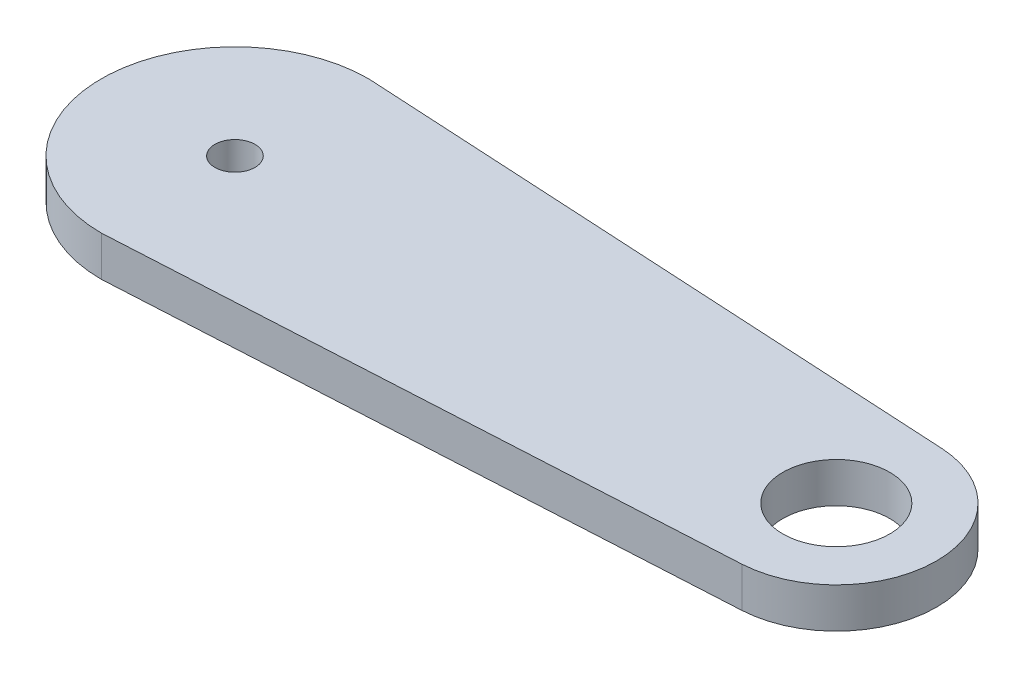
ISO-10303-21;
HEADER;
FILE_DESCRIPTION(('STEP AP214'),'2;1');
FILE_NAME('part.step','',(''),(''),'','','');
FILE_SCHEMA(('AUTOMOTIVE_DESIGN { 1 0 10303 214 1 1 1 1 }'));
ENDSEC;
DATA;
#1=APPLICATION_CONTEXT('core data for automotive mechanical design processes');
#2=APPLICATION_PROTOCOL_DEFINITION('international standard','automotive_design',2000,#1);
#3=PRODUCT_CONTEXT('',#1,'mechanical');
#4=PRODUCT('Part','Part','',(#3));
#5=PRODUCT_RELATED_PRODUCT_CATEGORY('part','',(#4));
#6=PRODUCT_DEFINITION_FORMATION('','',#4);
#7=PRODUCT_DEFINITION_CONTEXT('part definition',#1,'design');
#8=PRODUCT_DEFINITION('design','',#6,#7);
#9=PRODUCT_DEFINITION_SHAPE('','',#8);
#10=(LENGTH_UNIT() NAMED_UNIT(*) SI_UNIT(.MILLI.,.METRE.));
#11=(NAMED_UNIT(*) PLANE_ANGLE_UNIT() SI_UNIT($,.RADIAN.));
#12=(NAMED_UNIT(*) SI_UNIT($,.STERADIAN.) SOLID_ANGLE_UNIT());
#13=UNCERTAINTY_MEASURE_WITH_UNIT(LENGTH_MEASURE(1.E-05),#10,'distance_accuracy_value','');
#14=(GEOMETRIC_REPRESENTATION_CONTEXT(3) GLOBAL_UNCERTAINTY_ASSIGNED_CONTEXT((#13)) GLOBAL_UNIT_ASSIGNED_CONTEXT((#10,
#11,#12)) REPRESENTATION_CONTEXT('',''));
#15=CARTESIAN_POINT('',(0.,0.,0.));
#16=DIRECTION('',(0.,0.,1.));
#17=DIRECTION('',(1.,0.,0.));
#18=AXIS2_PLACEMENT_3D('',#15,#16,#17);
#19=CARTESIAN_POINT('',(0.551322959521135,3.,9.96951134361366));
#20=DIRECTION('',(-0.0552165341055908,0.,-0.998474403458279));
#21=DIRECTION('',(-0.998474403458279,0.,0.0552165341055908));
#22=AXIS2_PLACEMENT_3D('',#19,#20,#21);
#23=PLANE('',#22);
#24=DIRECTION('',(0.998474403458279,0.,-0.0552165341055908));
#25=VECTOR('',#24,1.);
#26=CARTESIAN_POINT('',(0.551322959521135,0.,9.96951134361366));
#27=LINE('',#26,#25);
#28=CARTESIAN_POINT('',(0.,0.,10.));
#29=VERTEX_POINT('',#28);
#30=CARTESIAN_POINT('',(45.4141240057906,0.,7.48855802574336));
#31=VERTEX_POINT('',#30);
#32=EDGE_CURVE('E95',#29,#31,#27,.T.);
#33=ORIENTED_EDGE('',*,*,#32,.T.);
#34=DIRECTION('',(0.,-1.,0.));
#35=VECTOR('',#34,1.);
#36=CARTESIAN_POINT('',(45.4141240057906,3.,7.48855802574336));
#37=LINE('',#36,#35);
#38=CARTESIAN_POINT('',(45.4141240057906,3.,7.48855802574336));
#39=VERTEX_POINT('',#38);
#40=EDGE_CURVE('E11',#39,#31,#37,.T.);
#41=ORIENTED_EDGE('',*,*,#40,.F.);
#42=DIRECTION('',(0.998474403458279,0.,-0.0552165341055908));
#43=VECTOR('',#42,1.);
#44=CARTESIAN_POINT('',(0.551322959521135,3.,9.96951134361366));
#45=LINE('',#44,#43);
#46=CARTESIAN_POINT('',(0.,3.,10.));
#47=VERTEX_POINT('',#46);
#48=EDGE_CURVE('E80',#47,#39,#45,.T.);
#49=ORIENTED_EDGE('',*,*,#48,.F.);
#50=DIRECTION('',(0.,-1.,0.));
#51=VECTOR('',#50,1.);
#52=CARTESIAN_POINT('',(0.,3.,10.));
#53=LINE('',#52,#51);
#54=EDGE_CURVE('E91',#47,#29,#53,.T.);
#55=ORIENTED_EDGE('',*,*,#54,.T.);
#56=EDGE_LOOP('',(#33,#41,#49,#55));
#57=FACE_BOUND('',#56,.T.);
#58=ADVANCED_FACE('F33',(#57),#23,.F.);
#59=CARTESIAN_POINT('',(45.,3.,-1.69055307946975E-10));
#60=DIRECTION('',(0.,-1.,0.));
#61=DIRECTION('',(0.,0.,-1.));
#62=AXIS2_PLACEMENT_3D('',#59,#60,#61);
#63=CYLINDRICAL_SURFACE('',#62,7.49999999995056);
#64=CARTESIAN_POINT('',(45.,0.,-1.69055307946975E-10));
#65=DIRECTION('',(0.,1.,0.));
#66=DIRECTION('',(0.,0.,1.));
#67=AXIS2_PLACEMENT_3D('',#64,#65,#66);
#68=CIRCLE('',#67,7.49999999995056);
#69=CARTESIAN_POINT('',(45.414124005735,0.,-7.48855802608454));
#70=VERTEX_POINT('',#69);
#71=EDGE_CURVE('E85',#31,#70,#68,.T.);
#72=ORIENTED_EDGE('',*,*,#71,.T.);
#73=DIRECTION('',(0.,-1.,0.));
#74=VECTOR('',#73,1.);
#75=CARTESIAN_POINT('',(45.414124005735,3.,-7.48855802608454));
#76=LINE('',#75,#74);
#77=CARTESIAN_POINT('',(45.414124005735,3.,-7.48855802608454));
#78=VERTEX_POINT('',#77);
#79=EDGE_CURVE('E41',#78,#70,#76,.T.);
#80=ORIENTED_EDGE('',*,*,#79,.F.);
#81=CARTESIAN_POINT('',(45.,3.,-1.69055307946975E-10));
#82=DIRECTION('',(0.,1.,0.));
#83=DIRECTION('',(0.,0.,1.));
#84=AXIS2_PLACEMENT_3D('',#81,#82,#83);
#85=CIRCLE('',#84,7.49999999995056);
#86=EDGE_CURVE('E75',#39,#78,#85,.T.);
#87=ORIENTED_EDGE('',*,*,#86,.F.);
#88=ORIENTED_EDGE('',*,*,#40,.T.);
#89=EDGE_LOOP('',(#72,#80,#87,#88));
#90=FACE_BOUND('',#89,.T.);
#91=ADVANCED_FACE('F84',(#90),#63,.T.);
#92=CARTESIAN_POINT('',(0.551322959447365,3.,-9.96951134362185));
#93=DIRECTION('',(0.0552165340981798,0.,-0.998474403458689));
#94=DIRECTION('',(-0.998474403458689,0.,-0.0552165340981799));
#95=AXIS2_PLACEMENT_3D('',#92,#93,#94);
#96=PLANE('',#95);
#97=DIRECTION('',(0.998474403458689,0.,0.0552165340981798));
#98=VECTOR('',#97,1.);
#99=CARTESIAN_POINT('',(0.551322959447365,0.,-9.96951134362185));
#100=LINE('',#99,#98);
#101=CARTESIAN_POINT('',(0.,0.,-10.));
#102=VERTEX_POINT('',#101);
#103=EDGE_CURVE('E100',#102,#70,#100,.T.);
#104=ORIENTED_EDGE('',*,*,#103,.F.);
#105=DIRECTION('',(0.,-1.,0.));
#106=VECTOR('',#105,1.);
#107=CARTESIAN_POINT('',(0.,3.,-10.));
#108=LINE('',#107,#106);
#109=CARTESIAN_POINT('',(0.,3.,-10.));
#110=VERTEX_POINT('',#109);
#111=EDGE_CURVE('E65',#110,#102,#108,.T.);
#112=ORIENTED_EDGE('',*,*,#111,.F.);
#113=DIRECTION('',(0.998474403458689,0.,0.0552165340981798));
#114=VECTOR('',#113,1.);
#115=CARTESIAN_POINT('',(0.551322959447365,3.,-9.96951134362185));
#116=LINE('',#115,#114);
#117=EDGE_CURVE('E78',#110,#78,#116,.T.);
#118=ORIENTED_EDGE('',*,*,#117,.T.);
#119=ORIENTED_EDGE('',*,*,#79,.T.);
#120=EDGE_LOOP('',(#104,#112,#118,#119));
#121=FACE_BOUND('',#120,.T.);
#122=ADVANCED_FACE('F89',(#121),#96,.T.);
#123=CARTESIAN_POINT('',(0.,3.,0.));
#124=DIRECTION('',(0.,-1.,0.));
#125=DIRECTION('',(0.,0.,-1.));
#126=AXIS2_PLACEMENT_3D('',#123,#124,#125);
#127=CYLINDRICAL_SURFACE('',#126,10.);
#128=CARTESIAN_POINT('',(0.,0.,0.));
#129=DIRECTION('',(0.,1.,0.));
#130=DIRECTION('',(0.,0.,1.));
#131=AXIS2_PLACEMENT_3D('',#128,#129,#130);
#132=CIRCLE('',#131,10.);
#133=EDGE_CURVE('E68',#102,#29,#132,.T.);
#134=ORIENTED_EDGE('',*,*,#133,.T.);
#135=ORIENTED_EDGE('',*,*,#54,.F.);
#136=CARTESIAN_POINT('',(0.,3.,0.));
#137=DIRECTION('',(0.,1.,0.));
#138=DIRECTION('',(0.,0.,1.));
#139=AXIS2_PLACEMENT_3D('',#136,#137,#138);
#140=CIRCLE('',#139,10.);
#141=EDGE_CURVE('E49',#110,#47,#140,.T.);
#142=ORIENTED_EDGE('',*,*,#141,.F.);
#143=ORIENTED_EDGE('',*,*,#111,.T.);
#144=EDGE_LOOP('',(#134,#135,#142,#143));
#145=FACE_BOUND('',#144,.T.);
#146=ADVANCED_FACE('F119',(#145),#127,.T.);
#147=CARTESIAN_POINT('',(0.,3.,0.));
#148=DIRECTION('',(0.,1.,0.));
#149=DIRECTION('',(0.,0.,1.));
#150=AXIS2_PLACEMENT_3D('',#147,#148,#149);
#151=PLANE('',#150);
#152=CARTESIAN_POINT('',(0.,3.,0.));
#153=DIRECTION('',(0.,1.,0.));
#154=DIRECTION('',(0.,0.,1.));
#155=AXIS2_PLACEMENT_3D('',#152,#153,#154);
#156=CIRCLE('',#155,1.5);
#157=CARTESIAN_POINT('',(0.,3.,1.5));
#158=VERTEX_POINT('',#157);
#159=EDGE_CURVE('E171',#158,#158,#156,.T.);
#160=ORIENTED_EDGE('',*,*,#159,.F.);
#161=EDGE_LOOP('',(#160));
#162=FACE_BOUND('',#161,.T.);
#163=CARTESIAN_POINT('',(45.,3.,-1.69055307946975E-10));
#164=DIRECTION('',(0.,1.,0.));
#165=DIRECTION('',(0.,0.,1.));
#166=AXIS2_PLACEMENT_3D('',#163,#164,#165);
#167=CIRCLE('',#166,4.);
#168=CARTESIAN_POINT('',(45.,3.,3.99999999983094));
#169=VERTEX_POINT('',#168);
#170=EDGE_CURVE('E177',#169,#169,#167,.T.);
#171=ORIENTED_EDGE('',*,*,#170,.F.);
#172=EDGE_LOOP('',(#171));
#173=FACE_BOUND('',#172,.T.);
#174=ORIENTED_EDGE('',*,*,#48,.T.);
#175=ORIENTED_EDGE('',*,*,#86,.T.);
#176=ORIENTED_EDGE('',*,*,#117,.F.);
#177=ORIENTED_EDGE('',*,*,#141,.T.);
#178=EDGE_LOOP('',(#174,#175,#176,#177));
#179=FACE_BOUND('',#178,.T.);
#180=ADVANCED_FACE('F76',(#162,#173,#179),#151,.T.);
#181=CARTESIAN_POINT('',(0.,0.,0.));
#182=DIRECTION('',(0.,1.,0.));
#183=DIRECTION('',(0.,0.,1.));
#184=AXIS2_PLACEMENT_3D('',#181,#182,#183);
#185=PLANE('',#184);
#186=CARTESIAN_POINT('',(0.,0.,0.));
#187=DIRECTION('',(0.,1.,0.));
#188=DIRECTION('',(0.,0.,1.));
#189=AXIS2_PLACEMENT_3D('',#186,#187,#188);
#190=CIRCLE('',#189,1.5);
#191=CARTESIAN_POINT('',(0.,0.,1.5));
#192=VERTEX_POINT('',#191);
#193=EDGE_CURVE('E98',#192,#192,#190,.F.);
#194=ORIENTED_EDGE('',*,*,#193,.F.);
#195=EDGE_LOOP('',(#194));
#196=FACE_BOUND('',#195,.T.);
#197=CARTESIAN_POINT('',(45.,0.,-1.69055307946975E-10));
#198=DIRECTION('',(0.,1.,0.));
#199=DIRECTION('',(0.,0.,1.));
#200=AXIS2_PLACEMENT_3D('',#197,#198,#199);
#201=CIRCLE('',#200,4.);
#202=CARTESIAN_POINT('',(45.,0.,3.99999999983094));
#203=VERTEX_POINT('',#202);
#204=EDGE_CURVE('E174',#203,#203,#201,.F.);
#205=ORIENTED_EDGE('',*,*,#204,.F.);
#206=EDGE_LOOP('',(#205));
#207=FACE_BOUND('',#206,.T.);
#208=ORIENTED_EDGE('',*,*,#32,.F.);
#209=ORIENTED_EDGE('',*,*,#133,.F.);
#210=ORIENTED_EDGE('',*,*,#103,.T.);
#211=ORIENTED_EDGE('',*,*,#71,.F.);
#212=EDGE_LOOP('',(#208,#209,#210,#211));
#213=FACE_BOUND('',#212,.T.);
#214=ADVANCED_FACE('F107',(#196,#207,#213),#185,.F.);
#215=CARTESIAN_POINT('',(45.,-0.00100000000000013,-1.69055307946975E-10));
#216=DIRECTION('',(0.,1.,0.));
#217=DIRECTION('',(0.,0.,1.));
#218=AXIS2_PLACEMENT_3D('',#215,#216,#217);
#219=CYLINDRICAL_SURFACE('',#218,4.);
#220=CARTESIAN_POINT('',(45.,3.,3.99999999983094));
#221=CARTESIAN_POINT('',(45.,2.96875,3.99999999983094));
#222=CARTESIAN_POINT('',(45.,2.9375,3.99999999983094));
#223=CARTESIAN_POINT('',(45.,2.875,3.99999999983094));
#224=CARTESIAN_POINT('',(45.,2.84375,3.99999999983094));
#225=CARTESIAN_POINT('',(45.,2.78125,3.99999999983094));
#226=CARTESIAN_POINT('',(45.,2.75,3.99999999983094));
#227=CARTESIAN_POINT('',(45.,2.6875,3.99999999983094));
#228=CARTESIAN_POINT('',(45.,2.65625,3.99999999983094));
#229=CARTESIAN_POINT('',(45.,2.59375,3.99999999983094));
#230=CARTESIAN_POINT('',(45.,2.5625,3.99999999983094));
#231=CARTESIAN_POINT('',(45.,2.5,3.99999999983094));
#232=CARTESIAN_POINT('',(45.,2.46875,3.99999999983094));
#233=CARTESIAN_POINT('',(45.,2.40625,3.99999999983094));
#234=CARTESIAN_POINT('',(45.,2.375,3.99999999983094));
#235=CARTESIAN_POINT('',(45.,2.3125,3.99999999983094));
#236=CARTESIAN_POINT('',(45.,2.28125,3.99999999983094));
#237=CARTESIAN_POINT('',(45.,2.21875,3.99999999983094));
#238=CARTESIAN_POINT('',(45.,2.1875,3.99999999983094));
#239=CARTESIAN_POINT('',(45.,2.125,3.99999999983094));
#240=CARTESIAN_POINT('',(45.,2.09375,3.99999999983094));
#241=CARTESIAN_POINT('',(45.,2.03125,3.99999999983094));
#242=CARTESIAN_POINT('',(45.,2.,3.99999999983094));
#243=CARTESIAN_POINT('',(45.,1.9375,3.99999999983094));
#244=CARTESIAN_POINT('',(45.,1.90625,3.99999999983094));
#245=CARTESIAN_POINT('',(45.,1.84375,3.99999999983094));
#246=CARTESIAN_POINT('',(45.,1.8125,3.99999999983094));
#247=CARTESIAN_POINT('',(45.,1.75,3.99999999983094));
#248=CARTESIAN_POINT('',(45.,1.71875,3.99999999983094));
#249=CARTESIAN_POINT('',(45.,1.65625,3.99999999983094));
#250=CARTESIAN_POINT('',(45.,1.625,3.99999999983094));
#251=CARTESIAN_POINT('',(45.,1.5625,3.99999999983094));
#252=CARTESIAN_POINT('',(45.,1.53125,3.99999999983094));
#253=CARTESIAN_POINT('',(45.,1.46875,3.99999999983094));
#254=CARTESIAN_POINT('',(45.,1.4375,3.99999999983094));
#255=CARTESIAN_POINT('',(45.,1.375,3.99999999983094));
#256=CARTESIAN_POINT('',(45.,1.34375,3.99999999983094));
#257=CARTESIAN_POINT('',(45.,1.28125,3.99999999983094));
#258=CARTESIAN_POINT('',(45.,1.25,3.99999999983094));
#259=CARTESIAN_POINT('',(45.,1.1875,3.99999999983094));
#260=CARTESIAN_POINT('',(45.,1.15625,3.99999999983094));
#261=CARTESIAN_POINT('',(45.,1.09375,3.99999999983094));
#262=CARTESIAN_POINT('',(45.,1.0625,3.99999999983094));
#263=CARTESIAN_POINT('',(45.,1.,3.99999999983094));
#264=CARTESIAN_POINT('',(45.,0.96875,3.99999999983094));
#265=CARTESIAN_POINT('',(45.,0.90625,3.99999999983094));
#266=CARTESIAN_POINT('',(45.,0.875,3.99999999983094));
#267=CARTESIAN_POINT('',(45.,0.8125,3.99999999983094));
#268=CARTESIAN_POINT('',(45.,0.78125,3.99999999983094));
#269=CARTESIAN_POINT('',(45.,0.71875,3.99999999983094));
#270=CARTESIAN_POINT('',(45.,0.6875,3.99999999983094));
#271=CARTESIAN_POINT('',(45.,0.625,3.99999999983094));
#272=CARTESIAN_POINT('',(45.,0.59375,3.99999999983094));
#273=CARTESIAN_POINT('',(45.,0.53125,3.99999999983094));
#274=CARTESIAN_POINT('',(45.,0.5,3.99999999983094));
#275=CARTESIAN_POINT('',(45.,0.4375,3.99999999983094));
#276=CARTESIAN_POINT('',(45.,0.40625,3.99999999983094));
#277=CARTESIAN_POINT('',(45.,0.34375,3.99999999983094));
#278=CARTESIAN_POINT('',(45.,0.3125,3.99999999983094));
#279=CARTESIAN_POINT('',(45.,0.25,3.99999999983094));
#280=CARTESIAN_POINT('',(45.,0.21875,3.99999999983094));
#281=CARTESIAN_POINT('',(45.,0.15625,3.99999999983094));
#282=CARTESIAN_POINT('',(45.,0.125,3.99999999983094));
#283=CARTESIAN_POINT('',(45.,0.0625000000000001,3.99999999983094));
#284=CARTESIAN_POINT('',(45.,0.0312500000000001,3.99999999983094));
#285=CARTESIAN_POINT('',(45.,0.,3.99999999983094));
#286=B_SPLINE_CURVE_WITH_KNOTS('',3,(#220,#221,#222,#223,#224,#225,#226,#227,#228,#229,#230,
#231,#232,#233,#234,#235,#236,#237,#238,#239,#240,#241,#242,#243,#244,#245,#246,#247,#248,#249,
#250,#251,#252,#253,#254,#255,#256,#257,#258,#259,#260,#261,#262,#263,#264,#265,#266,#267,#268,
#269,#270,#271,#272,#273,#274,#275,#276,#277,#278,#279,#280,#281,#282,#283,#284,#285),
.UNSPECIFIED.,.F.,.F.,(4,2,2,2,2,2,2,2,2,2,2,2,2,2,2,2,2,2,2,2,2,2,2,2,2,2,2,2,2,2,2,2,4),(0.,
0.0937500000000001,0.1875,0.28125,0.375,0.46875,0.5625,0.65625,0.75,0.84375,0.9375,1.03125,
1.125,1.21875,1.3125,1.40625,1.5,1.59375,1.6875,1.78125,1.875,1.96875,2.0625,2.15625,2.25,
2.34375,2.4375,2.53125,2.625,2.71875,2.8125,2.90625,3.),.UNSPECIFIED.);
#287=EDGE_CURVE('BSEAM109',#169,#203,#286,.T.);
#288=ORIENTED_EDGE('',*,*,#170,.T.);
#289=ORIENTED_EDGE('',*,*,#204,.T.);
#290=ORIENTED_EDGE('',*,*,#287,.T.);
#291=ORIENTED_EDGE('',*,*,#287,.F.);
#292=EDGE_LOOP('',(#288,#290,#289,#291));
#293=FACE_BOUND('',#292,.T.);
#294=ADVANCED_FACE('F109',(#293),#219,.F.);
#295=CARTESIAN_POINT('',(0.,-0.00100000000000013,0.));
#296=DIRECTION('',(0.,1.,0.));
#297=DIRECTION('',(0.,0.,1.));
#298=AXIS2_PLACEMENT_3D('',#295,#296,#297);
#299=CYLINDRICAL_SURFACE('',#298,1.5);
#300=CARTESIAN_POINT('',(0.,3.,1.5));
#301=CARTESIAN_POINT('',(0.,2.96875,1.5));
#302=CARTESIAN_POINT('',(0.,2.9375,1.5));
#303=CARTESIAN_POINT('',(0.,2.875,1.5));
#304=CARTESIAN_POINT('',(0.,2.84375,1.5));
#305=CARTESIAN_POINT('',(0.,2.78125,1.5));
#306=CARTESIAN_POINT('',(0.,2.75,1.5));
#307=CARTESIAN_POINT('',(0.,2.6875,1.5));
#308=CARTESIAN_POINT('',(0.,2.65625,1.5));
#309=CARTESIAN_POINT('',(0.,2.59375,1.5));
#310=CARTESIAN_POINT('',(0.,2.5625,1.5));
#311=CARTESIAN_POINT('',(0.,2.5,1.5));
#312=CARTESIAN_POINT('',(0.,2.46875,1.5));
#313=CARTESIAN_POINT('',(0.,2.40625,1.5));
#314=CARTESIAN_POINT('',(0.,2.375,1.5));
#315=CARTESIAN_POINT('',(0.,2.3125,1.5));
#316=CARTESIAN_POINT('',(0.,2.28125,1.5));
#317=CARTESIAN_POINT('',(0.,2.21875,1.5));
#318=CARTESIAN_POINT('',(0.,2.1875,1.5));
#319=CARTESIAN_POINT('',(0.,2.125,1.5));
#320=CARTESIAN_POINT('',(0.,2.09375,1.5));
#321=CARTESIAN_POINT('',(0.,2.03125,1.5));
#322=CARTESIAN_POINT('',(0.,2.,1.5));
#323=CARTESIAN_POINT('',(0.,1.9375,1.5));
#324=CARTESIAN_POINT('',(0.,1.90625,1.5));
#325=CARTESIAN_POINT('',(0.,1.84375,1.5));
#326=CARTESIAN_POINT('',(0.,1.8125,1.5));
#327=CARTESIAN_POINT('',(0.,1.75,1.5));
#328=CARTESIAN_POINT('',(0.,1.71875,1.5));
#329=CARTESIAN_POINT('',(0.,1.65625,1.5));
#330=CARTESIAN_POINT('',(0.,1.625,1.5));
#331=CARTESIAN_POINT('',(0.,1.5625,1.5));
#332=CARTESIAN_POINT('',(0.,1.53125,1.5));
#333=CARTESIAN_POINT('',(0.,1.46875,1.5));
#334=CARTESIAN_POINT('',(0.,1.4375,1.5));
#335=CARTESIAN_POINT('',(0.,1.375,1.5));
#336=CARTESIAN_POINT('',(0.,1.34375,1.5));
#337=CARTESIAN_POINT('',(0.,1.28125,1.5));
#338=CARTESIAN_POINT('',(0.,1.25,1.5));
#339=CARTESIAN_POINT('',(0.,1.1875,1.5));
#340=CARTESIAN_POINT('',(0.,1.15625,1.5));
#341=CARTESIAN_POINT('',(0.,1.09375,1.5));
#342=CARTESIAN_POINT('',(0.,1.0625,1.5));
#343=CARTESIAN_POINT('',(0.,1.,1.5));
#344=CARTESIAN_POINT('',(0.,0.96875,1.5));
#345=CARTESIAN_POINT('',(0.,0.90625,1.5));
#346=CARTESIAN_POINT('',(0.,0.875,1.5));
#347=CARTESIAN_POINT('',(0.,0.8125,1.5));
#348=CARTESIAN_POINT('',(0.,0.78125,1.5));
#349=CARTESIAN_POINT('',(0.,0.71875,1.5));
#350=CARTESIAN_POINT('',(0.,0.6875,1.5));
#351=CARTESIAN_POINT('',(0.,0.625,1.5));
#352=CARTESIAN_POINT('',(0.,0.59375,1.5));
#353=CARTESIAN_POINT('',(0.,0.53125,1.5));
#354=CARTESIAN_POINT('',(0.,0.5,1.5));
#355=CARTESIAN_POINT('',(0.,0.4375,1.5));
#356=CARTESIAN_POINT('',(0.,0.40625,1.5));
#357=CARTESIAN_POINT('',(0.,0.34375,1.5));
#358=CARTESIAN_POINT('',(0.,0.3125,1.5));
#359=CARTESIAN_POINT('',(0.,0.25,1.5));
#360=CARTESIAN_POINT('',(0.,0.21875,1.5));
#361=CARTESIAN_POINT('',(0.,0.15625,1.5));
#362=CARTESIAN_POINT('',(0.,0.125,1.5));
#363=CARTESIAN_POINT('',(0.,0.0625000000000001,1.5));
#364=CARTESIAN_POINT('',(0.,0.0312500000000001,1.5));
#365=CARTESIAN_POINT('',(0.,0.,1.5));
#366=B_SPLINE_CURVE_WITH_KNOTS('',3,(#300,#301,#302,#303,#304,#305,#306,#307,#308,#309,#310,
#311,#312,#313,#314,#315,#316,#317,#318,#319,#320,#321,#322,#323,#324,#325,#326,#327,#328,#329,
#330,#331,#332,#333,#334,#335,#336,#337,#338,#339,#340,#341,#342,#343,#344,#345,#346,#347,#348,
#349,#350,#351,#352,#353,#354,#355,#356,#357,#358,#359,#360,#361,#362,#363,#364,#365),
.UNSPECIFIED.,.F.,.F.,(4,2,2,2,2,2,2,2,2,2,2,2,2,2,2,2,2,2,2,2,2,2,2,2,2,2,2,2,2,2,2,2,4),(0.,
0.0937500000000001,0.1875,0.28125,0.375,0.46875,0.5625,0.65625,0.75,0.84375,0.9375,1.03125,
1.125,1.21875,1.3125,1.40625,1.5,1.59375,1.6875,1.78125,1.875,1.96875,2.0625,2.15625,2.25,
2.34375,2.4375,2.53125,2.625,2.71875,2.8125,2.90625,3.),.UNSPECIFIED.);
#367=EDGE_CURVE('BSEAM116',#158,#192,#366,.T.);
#368=ORIENTED_EDGE('',*,*,#159,.T.);
#369=ORIENTED_EDGE('',*,*,#193,.T.);
#370=ORIENTED_EDGE('',*,*,#367,.T.);
#371=ORIENTED_EDGE('',*,*,#367,.F.);
#372=EDGE_LOOP('',(#368,#370,#369,#371));
#373=FACE_BOUND('',#372,.T.);
#374=ADVANCED_FACE('F116',(#373),#299,.F.);
#375=CLOSED_SHELL('',(#58,#91,#122,#146,#180,#214,#294,#374));
#376=MANIFOLD_SOLID_BREP('B2',#375);
#377=ADVANCED_BREP_SHAPE_REPRESENTATION('',(#18,#376),#14);
#378=SHAPE_DEFINITION_REPRESENTATION(#9,#377);
ENDSEC;
END-ISO-10303-21;
